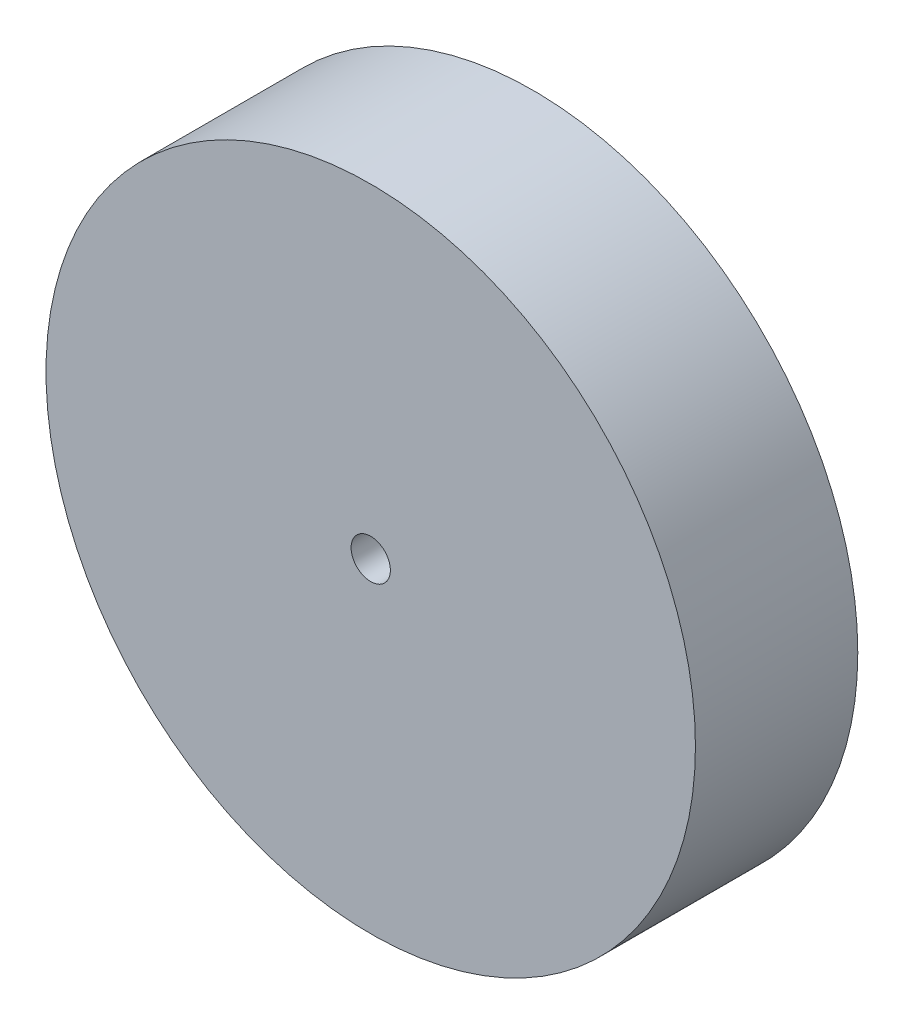
ISO-10303-21;
HEADER;
FILE_DESCRIPTION(('STEP AP214'),'2;1');
FILE_NAME('part.step','',(''),(''),'','','');
FILE_SCHEMA(('AUTOMOTIVE_DESIGN { 1 0 10303 214 1 1 1 1 }'));
ENDSEC;
DATA;
#1=APPLICATION_CONTEXT('core data for automotive mechanical design processes');
#2=APPLICATION_PROTOCOL_DEFINITION('international standard','automotive_design',2000,#1);
#3=PRODUCT_CONTEXT('',#1,'mechanical');
#4=PRODUCT('Part','Part','',(#3));
#5=PRODUCT_RELATED_PRODUCT_CATEGORY('part','',(#4));
#6=PRODUCT_DEFINITION_FORMATION('','',#4);
#7=PRODUCT_DEFINITION_CONTEXT('part definition',#1,'design');
#8=PRODUCT_DEFINITION('design','',#6,#7);
#9=PRODUCT_DEFINITION_SHAPE('','',#8);
#10=(LENGTH_UNIT() NAMED_UNIT(*) SI_UNIT(.MILLI.,.METRE.));
#11=(NAMED_UNIT(*) PLANE_ANGLE_UNIT() SI_UNIT($,.RADIAN.));
#12=(NAMED_UNIT(*) SI_UNIT($,.STERADIAN.) SOLID_ANGLE_UNIT());
#13=UNCERTAINTY_MEASURE_WITH_UNIT(LENGTH_MEASURE(1.E-05),#10,'distance_accuracy_value','');
#14=(GEOMETRIC_REPRESENTATION_CONTEXT(3) GLOBAL_UNCERTAINTY_ASSIGNED_CONTEXT((#13)) GLOBAL_UNIT_ASSIGNED_CONTEXT((#10,
#11,#12)) REPRESENTATION_CONTEXT('',''));
#15=CARTESIAN_POINT('',(0.,0.,0.));
#16=DIRECTION('',(0.,0.,1.));
#17=DIRECTION('',(1.,0.,0.));
#18=AXIS2_PLACEMENT_3D('',#15,#16,#17);
#19=CARTESIAN_POINT('',(0.,0.,25.));
#20=DIRECTION('',(0.,0.,1.));
#21=DIRECTION('',(1.,0.,0.));
#22=AXIS2_PLACEMENT_3D('',#19,#20,#21);
#23=PLANE('',#22);
#24=CARTESIAN_POINT('',(0.,0.,25.));
#25=DIRECTION('',(0.,0.,1.));
#26=DIRECTION('',(1.,0.,0.));
#27=AXIS2_PLACEMENT_3D('',#24,#25,#26);
#28=CIRCLE('',#27,100.);
#29=CARTESIAN_POINT('',(100.,0.,25.));
#30=VERTEX_POINT('',#29);
#31=EDGE_CURVE('E10',#30,#30,#28,.T.);
#32=ORIENTED_EDGE('',*,*,#31,.T.);
#33=EDGE_LOOP('',(#32));
#34=FACE_BOUND('',#33,.T.);
#35=CARTESIAN_POINT('',(0.,0.,25.));
#36=DIRECTION('',(0.,0.,1.));
#37=DIRECTION('',(1.,0.,0.));
#38=AXIS2_PLACEMENT_3D('',#35,#36,#37);
#39=CIRCLE('',#38,6.05);
#40=CARTESIAN_POINT('',(6.05,0.,25.));
#41=VERTEX_POINT('',#40);
#42=EDGE_CURVE('E43',#41,#41,#39,.T.);
#43=ORIENTED_EDGE('',*,*,#42,.F.);
#44=EDGE_LOOP('',(#43));
#45=FACE_BOUND('',#44,.T.);
#46=ADVANCED_FACE('F32',(#34,#45),#23,.T.);
#47=CARTESIAN_POINT('',(0.,0.,-25.));
#48=DIRECTION('',(0.,0.,1.));
#49=DIRECTION('',(1.,0.,0.));
#50=AXIS2_PLACEMENT_3D('',#47,#48,#49);
#51=PLANE('',#50);
#52=CARTESIAN_POINT('',(0.,0.,-25.));
#53=DIRECTION('',(0.,0.,1.));
#54=DIRECTION('',(1.,0.,0.));
#55=AXIS2_PLACEMENT_3D('',#52,#53,#54);
#56=CIRCLE('',#55,100.);
#57=CARTESIAN_POINT('',(100.,0.,-25.));
#58=VERTEX_POINT('',#57);
#59=EDGE_CURVE('E36',#58,#58,#56,.T.);
#60=ORIENTED_EDGE('',*,*,#59,.F.);
#61=EDGE_LOOP('',(#60));
#62=FACE_BOUND('',#61,.T.);
#63=CARTESIAN_POINT('',(0.,0.,-25.));
#64=DIRECTION('',(0.,0.,1.));
#65=DIRECTION('',(1.,0.,0.));
#66=AXIS2_PLACEMENT_3D('',#63,#64,#65);
#67=CIRCLE('',#66,6.05);
#68=CARTESIAN_POINT('',(6.05,0.,-25.));
#69=VERTEX_POINT('',#68);
#70=EDGE_CURVE('E45',#69,#69,#67,.T.);
#71=ORIENTED_EDGE('',*,*,#70,.T.);
#72=EDGE_LOOP('',(#71));
#73=FACE_BOUND('',#72,.T.);
#74=ADVANCED_FACE('F55',(#62,#73),#51,.F.);
#75=CARTESIAN_POINT('',(0.,0.,25.));
#76=DIRECTION('',(0.,0.,-1.));
#77=DIRECTION('',(-1.,0.,0.));
#78=AXIS2_PLACEMENT_3D('',#75,#76,#77);
#79=CYLINDRICAL_SURFACE('',#78,100.);
#80=ORIENTED_EDGE('',*,*,#31,.F.);
#81=EDGE_LOOP('',(#80));
#82=FACE_BOUND('',#81,.T.);
#83=ORIENTED_EDGE('',*,*,#59,.T.);
#84=EDGE_LOOP('',(#83));
#85=FACE_BOUND('',#84,.T.);
#86=ADVANCED_FACE('F34',(#82,#85),#79,.T.);
#87=CARTESIAN_POINT('',(0.,0.,25.));
#88=DIRECTION('',(0.,0.,-1.));
#89=DIRECTION('',(-1.,0.,0.));
#90=AXIS2_PLACEMENT_3D('',#87,#88,#89);
#91=CYLINDRICAL_SURFACE('',#90,6.05);
#92=ORIENTED_EDGE('',*,*,#42,.T.);
#93=EDGE_LOOP('',(#92));
#94=FACE_BOUND('',#93,.T.);
#95=ORIENTED_EDGE('',*,*,#70,.F.);
#96=EDGE_LOOP('',(#95));
#97=FACE_BOUND('',#96,.T.);
#98=ADVANCED_FACE('F51',(#94,#97),#91,.F.);
#99=CLOSED_SHELL('',(#46,#74,#86,#98));
#100=MANIFOLD_SOLID_BREP('B2',#99);
#101=ADVANCED_BREP_SHAPE_REPRESENTATION('',(#18,#100),#14);
#102=SHAPE_DEFINITION_REPRESENTATION(#9,#101);
ENDSEC;
END-ISO-10303-21;
